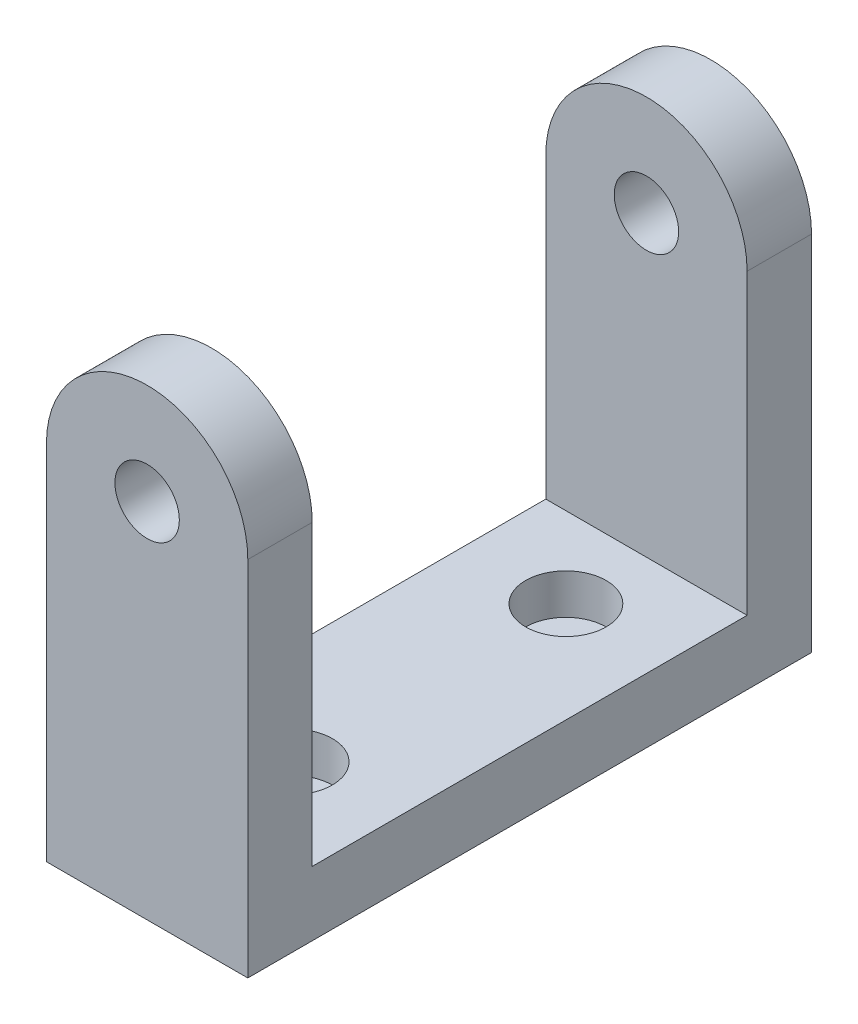
ISO-10303-21;
HEADER;
FILE_DESCRIPTION(('STEP AP214'),'2;1');
FILE_NAME('part.step','',(''),(''),'','','');
FILE_SCHEMA(('AUTOMOTIVE_DESIGN { 1 0 10303 214 1 1 1 1 }'));
ENDSEC;
DATA;
#1=APPLICATION_CONTEXT('core data for automotive mechanical design processes');
#2=APPLICATION_PROTOCOL_DEFINITION('international standard','automotive_design',2000,#1);
#3=PRODUCT_CONTEXT('',#1,'mechanical');
#4=PRODUCT('Part','Part','',(#3));
#5=PRODUCT_RELATED_PRODUCT_CATEGORY('part','',(#4));
#6=PRODUCT_DEFINITION_FORMATION('','',#4);
#7=PRODUCT_DEFINITION_CONTEXT('part definition',#1,'design');
#8=PRODUCT_DEFINITION('design','',#6,#7);
#9=PRODUCT_DEFINITION_SHAPE('','',#8);
#10=(LENGTH_UNIT() NAMED_UNIT(*) SI_UNIT(.MILLI.,.METRE.));
#11=(NAMED_UNIT(*) PLANE_ANGLE_UNIT() SI_UNIT($,.RADIAN.));
#12=(NAMED_UNIT(*) SI_UNIT($,.STERADIAN.) SOLID_ANGLE_UNIT());
#13=UNCERTAINTY_MEASURE_WITH_UNIT(LENGTH_MEASURE(1.E-05),#10,'distance_accuracy_value','');
#14=(GEOMETRIC_REPRESENTATION_CONTEXT(3) GLOBAL_UNCERTAINTY_ASSIGNED_CONTEXT((#13)) GLOBAL_UNIT_ASSIGNED_CONTEXT((#10,
#11,#12)) REPRESENTATION_CONTEXT('',''));
#15=CARTESIAN_POINT('',(0.,0.,0.));
#16=DIRECTION('',(0.,0.,1.));
#17=DIRECTION('',(1.,0.,0.));
#18=AXIS2_PLACEMENT_3D('',#15,#16,#17);
#19=CARTESIAN_POINT('',(-16.1932057392095,27.8256302521008,0.));
#20=DIRECTION('',(0.,0.,-1.));
#21=DIRECTION('',(-1.,0.,0.));
#22=AXIS2_PLACEMENT_3D('',#19,#20,#21);
#23=CYLINDRICAL_SURFACE('',#22,12.5);
#24=CARTESIAN_POINT('',(-16.1932057392095,27.8256302521008,62.));
#25=DIRECTION('',(0.,0.,1.));
#26=DIRECTION('',(0.,-1.,0.));
#27=AXIS2_PLACEMENT_3D('',#24,#25,#26);
#28=CIRCLE('',#27,12.5);
#29=CARTESIAN_POINT('',(-28.6932057392095,27.8256302521008,62.));
#30=VERTEX_POINT('',#29);
#31=CARTESIAN_POINT('',(-3.69320573920951,27.8256302521009,62.));
#32=VERTEX_POINT('',#31);
#33=EDGE_CURVE('E156',#30,#32,#28,.F.);
#34=ORIENTED_EDGE('',*,*,#33,.F.);
#35=DIRECTION('',(0.,0.,-1.));
#36=VECTOR('',#35,1.);
#37=CARTESIAN_POINT('',(-28.6932057392095,27.8256302521008,70.));
#38=LINE('',#37,#36);
#39=CARTESIAN_POINT('',(-28.6932057392095,27.8256302521008,70.));
#40=VERTEX_POINT('',#39);
#41=EDGE_CURVE('E134',#40,#30,#38,.T.);
#42=ORIENTED_EDGE('',*,*,#41,.F.);
#43=CARTESIAN_POINT('',(-16.1932057392095,27.8256302521008,70.));
#44=DIRECTION('',(0.,0.,1.));
#45=DIRECTION('',(1.,0.,0.));
#46=AXIS2_PLACEMENT_3D('',#43,#44,#45);
#47=CIRCLE('',#46,12.5);
#48=CARTESIAN_POINT('',(-3.69320573920951,27.8256302521009,70.));
#49=VERTEX_POINT('',#48);
#50=EDGE_CURVE('E58',#49,#40,#47,.T.);
#51=ORIENTED_EDGE('',*,*,#50,.F.);
#52=DIRECTION('',(0.,0.,-1.));
#53=VECTOR('',#52,1.);
#54=CARTESIAN_POINT('',(-3.69320573920951,27.8256302521009,70.));
#55=LINE('',#54,#53);
#56=EDGE_CURVE('E186',#32,#49,#55,.F.);
#57=ORIENTED_EDGE('',*,*,#56,.F.);
#58=EDGE_LOOP('',(#34,#42,#51,#57));
#59=FACE_BOUND('',#58,.T.);
#60=ADVANCED_FACE('F47',(#59),#23,.T.);
#61=CARTESIAN_POINT('',(-16.1932057392095,27.8256302521008,8.));
#62=DIRECTION('',(0.,0.,-1.));
#63=DIRECTION('',(0.,1.,0.));
#64=AXIS2_PLACEMENT_3D('',#61,#62,#63);
#65=CIRCLE('',#64,12.5);
#66=CARTESIAN_POINT('',(-3.69320573920951,27.8256302521009,8.));
#67=VERTEX_POINT('',#66);
#68=CARTESIAN_POINT('',(-28.6932057392095,27.8256302521008,8.));
#69=VERTEX_POINT('',#68);
#70=EDGE_CURVE('E152',#67,#69,#65,.F.);
#71=ORIENTED_EDGE('',*,*,#70,.F.);
#72=CARTESIAN_POINT('',(-3.69320573920951,27.8256302521009,0.));
#73=VERTEX_POINT('',#72);
#74=EDGE_CURVE('E187',#73,#67,#55,.F.);
#75=ORIENTED_EDGE('',*,*,#74,.F.);
#76=CARTESIAN_POINT('',(-16.1932057392095,27.8256302521008,0.));
#77=DIRECTION('',(0.,0.,1.));
#78=DIRECTION('',(1.,0.,0.));
#79=AXIS2_PLACEMENT_3D('',#76,#77,#78);
#80=CIRCLE('',#79,12.5);
#81=CARTESIAN_POINT('',(-28.6932057392095,27.8256302521008,0.));
#82=VERTEX_POINT('',#81);
#83=EDGE_CURVE('E194',#82,#73,#80,.F.);
#84=ORIENTED_EDGE('',*,*,#83,.F.);
#85=EDGE_CURVE('E191',#69,#82,#38,.T.);
#86=ORIENTED_EDGE('',*,*,#85,.F.);
#87=EDGE_LOOP('',(#71,#75,#84,#86));
#88=FACE_BOUND('',#87,.T.);
#89=ADVANCED_FACE('F50',(#88),#23,.T.);
#90=CARTESIAN_POINT('',(-28.6932057392095,40.3256302521008,70.));
#91=DIRECTION('',(1.,0.,0.));
#92=DIRECTION('',(0.,1.,0.));
#93=AXIS2_PLACEMENT_3D('',#90,#91,#92);
#94=PLANE('',#93);
#95=ORIENTED_EDGE('',*,*,#41,.T.);
#96=DIRECTION('',(0.,-1.,0.));
#97=VECTOR('',#96,1.);
#98=CARTESIAN_POINT('',(-28.6932057392095,40.3256302521008,62.));
#99=LINE('',#98,#97);
#100=CARTESIAN_POINT('',(-28.6932057392095,-9.17436974789917,62.));
#101=VERTEX_POINT('',#100);
#102=EDGE_CURVE('E116',#30,#101,#99,.T.);
#103=ORIENTED_EDGE('',*,*,#102,.T.);
#104=DIRECTION('',(0.,0.,-1.));
#105=VECTOR('',#104,1.);
#106=CARTESIAN_POINT('',(-28.6932057392095,-9.17436974789917,62.));
#107=LINE('',#106,#105);
#108=CARTESIAN_POINT('',(-28.6932057392095,-9.17436974789917,7.99999999999999));
#109=VERTEX_POINT('',#108);
#110=EDGE_CURVE('E124',#101,#109,#107,.T.);
#111=ORIENTED_EDGE('',*,*,#110,.T.);
#112=DIRECTION('',(0.,1.,0.));
#113=VECTOR('',#112,1.);
#114=CARTESIAN_POINT('',(-28.6932057392095,40.3256302521008,8.));
#115=LINE('',#114,#113);
#116=EDGE_CURVE('E121',#109,#69,#115,.T.);
#117=ORIENTED_EDGE('',*,*,#116,.T.);
#118=ORIENTED_EDGE('',*,*,#85,.T.);
#119=DIRECTION('',(0.,-1.,0.));
#120=VECTOR('',#119,1.);
#121=CARTESIAN_POINT('',(-28.6932057392095,40.3256302521008,0.));
#122=LINE('',#121,#120);
#123=CARTESIAN_POINT('',(-28.6932057392095,-17.1743697478992,0.));
#124=VERTEX_POINT('',#123);
#125=EDGE_CURVE('E159',#82,#124,#122,.T.);
#126=ORIENTED_EDGE('',*,*,#125,.T.);
#127=DIRECTION('',(0.,0.,-1.));
#128=VECTOR('',#127,1.);
#129=CARTESIAN_POINT('',(-28.6932057392095,-17.1743697478992,70.));
#130=LINE('',#129,#128);
#131=CARTESIAN_POINT('',(-28.6932057392095,-17.1743697478992,70.));
#132=VERTEX_POINT('',#131);
#133=EDGE_CURVE('E182',#132,#124,#130,.T.);
#134=ORIENTED_EDGE('',*,*,#133,.F.);
#135=DIRECTION('',(0.,-1.,0.));
#136=VECTOR('',#135,1.);
#137=CARTESIAN_POINT('',(-28.6932057392095,40.3256302521008,70.));
#138=LINE('',#137,#136);
#139=EDGE_CURVE('E160',#40,#132,#138,.T.);
#140=ORIENTED_EDGE('',*,*,#139,.F.);
#141=EDGE_LOOP('',(#95,#103,#111,#117,#118,#126,#134,#140));
#142=FACE_BOUND('',#141,.T.);
#143=ADVANCED_FACE('F132',(#142),#94,.F.);
#144=CARTESIAN_POINT('',(-28.6932057392095,-17.1743697478992,70.));
#145=DIRECTION('',(0.,1.,0.));
#146=DIRECTION('',(0.,0.,1.));
#147=AXIS2_PLACEMENT_3D('',#144,#145,#146);
#148=PLANE('',#147);
#149=DIRECTION('',(1.,0.,0.));
#150=VECTOR('',#149,1.);
#151=CARTESIAN_POINT('',(-28.6932057392095,-17.1743697478992,0.));
#152=LINE('',#151,#150);
#153=CARTESIAN_POINT('',(-3.69320573920951,-17.1743697478992,0.));
#154=VERTEX_POINT('',#153);
#155=EDGE_CURVE('E173',#124,#154,#152,.T.);
#156=ORIENTED_EDGE('',*,*,#155,.T.);
#157=DIRECTION('',(0.,0.,-1.));
#158=VECTOR('',#157,1.);
#159=CARTESIAN_POINT('',(-3.69320573920951,-17.1743697478992,70.));
#160=LINE('',#159,#158);
#161=CARTESIAN_POINT('',(-3.69320573920951,-17.1743697478992,70.));
#162=VERTEX_POINT('',#161);
#163=EDGE_CURVE('E170',#162,#154,#160,.T.);
#164=ORIENTED_EDGE('',*,*,#163,.F.);
#165=DIRECTION('',(1.,0.,0.));
#166=VECTOR('',#165,1.);
#167=CARTESIAN_POINT('',(-28.6932057392095,-17.1743697478992,70.));
#168=LINE('',#167,#166);
#169=EDGE_CURVE('E163',#132,#162,#168,.T.);
#170=ORIENTED_EDGE('',*,*,#169,.F.);
#171=ORIENTED_EDGE('',*,*,#133,.T.);
#172=EDGE_LOOP('',(#156,#164,#170,#171));
#173=FACE_BOUND('',#172,.T.);
#174=ADVANCED_FACE('F210',(#173),#148,.F.);
#175=CARTESIAN_POINT('',(-3.69320573920951,40.3256302521008,70.));
#176=DIRECTION('',(-1.,0.,0.));
#177=DIRECTION('',(0.,-1.,0.));
#178=AXIS2_PLACEMENT_3D('',#175,#176,#177);
#179=PLANE('',#178);
#180=DIRECTION('',(0.,0.,-1.));
#181=VECTOR('',#180,1.);
#182=CARTESIAN_POINT('',(-3.69320573920951,-9.17436974789916,62.));
#183=LINE('',#182,#181);
#184=CARTESIAN_POINT('',(-3.69320573920951,-9.17436974789915,62.));
#185=VERTEX_POINT('',#184);
#186=CARTESIAN_POINT('',(-3.69320573920951,-9.17436974789916,7.99999999999999));
#187=VERTEX_POINT('',#186);
#188=EDGE_CURVE('E140',#185,#187,#183,.T.);
#189=ORIENTED_EDGE('',*,*,#188,.F.);
#190=DIRECTION('',(0.,1.,0.));
#191=VECTOR('',#190,1.);
#192=CARTESIAN_POINT('',(-3.69320573920951,40.3256302521008,62.));
#193=LINE('',#192,#191);
#194=EDGE_CURVE('E11',#185,#32,#193,.T.);
#195=ORIENTED_EDGE('',*,*,#194,.T.);
#196=ORIENTED_EDGE('',*,*,#56,.T.);
#197=DIRECTION('',(0.,1.,0.));
#198=VECTOR('',#197,1.);
#199=CARTESIAN_POINT('',(-3.69320573920951,40.3256302521008,70.));
#200=LINE('',#199,#198);
#201=EDGE_CURVE('E167',#162,#49,#200,.T.);
#202=ORIENTED_EDGE('',*,*,#201,.F.);
#203=ORIENTED_EDGE('',*,*,#163,.T.);
#204=DIRECTION('',(0.,1.,0.));
#205=VECTOR('',#204,1.);
#206=CARTESIAN_POINT('',(-3.69320573920951,40.3256302521008,0.));
#207=LINE('',#206,#205);
#208=EDGE_CURVE('E164',#154,#73,#207,.T.);
#209=ORIENTED_EDGE('',*,*,#208,.T.);
#210=ORIENTED_EDGE('',*,*,#74,.T.);
#211=DIRECTION('',(0.,1.,0.));
#212=VECTOR('',#211,1.);
#213=CARTESIAN_POINT('',(-3.69320573920951,40.3256302521008,8.));
#214=LINE('',#213,#212);
#215=EDGE_CURVE('E136',#187,#67,#214,.T.);
#216=ORIENTED_EDGE('',*,*,#215,.F.);
#217=EDGE_LOOP('',(#189,#195,#196,#202,#203,#209,#210,#216));
#218=FACE_BOUND('',#217,.T.);
#219=ADVANCED_FACE('F203',(#218),#179,.F.);
#220=CARTESIAN_POINT('',(0.,0.,70.));
#221=DIRECTION('',(0.,0.,1.));
#222=DIRECTION('',(1.,0.,0.));
#223=AXIS2_PLACEMENT_3D('',#220,#221,#222);
#224=PLANE('',#223);
#225=CARTESIAN_POINT('',(-16.1932057392095,27.8256302521008,70.));
#226=DIRECTION('',(0.,0.,1.));
#227=DIRECTION('',(1.,0.,0.));
#228=AXIS2_PLACEMENT_3D('',#225,#226,#227);
#229=CIRCLE('',#228,4.);
#230=CARTESIAN_POINT('',(-12.1932057392095,27.8256302521008,70.));
#231=VERTEX_POINT('',#230);
#232=EDGE_CURVE('E262',#231,#231,#229,.T.);
#233=ORIENTED_EDGE('',*,*,#232,.F.);
#234=EDGE_LOOP('',(#233));
#235=FACE_BOUND('',#234,.T.);
#236=ORIENTED_EDGE('',*,*,#201,.T.);
#237=ORIENTED_EDGE('',*,*,#50,.T.);
#238=ORIENTED_EDGE('',*,*,#139,.T.);
#239=ORIENTED_EDGE('',*,*,#169,.T.);
#240=EDGE_LOOP('',(#236,#237,#238,#239));
#241=FACE_BOUND('',#240,.T.);
#242=ADVANCED_FACE('F205',(#235,#241),#224,.T.);
#243=CARTESIAN_POINT('',(0.,0.,0.));
#244=DIRECTION('',(0.,0.,1.));
#245=DIRECTION('',(1.,0.,0.));
#246=AXIS2_PLACEMENT_3D('',#243,#244,#245);
#247=PLANE('',#246);
#248=CARTESIAN_POINT('',(-16.1932057392095,27.8256302521008,0.));
#249=DIRECTION('',(0.,0.,1.));
#250=DIRECTION('',(1.,0.,0.));
#251=AXIS2_PLACEMENT_3D('',#248,#249,#250);
#252=CIRCLE('',#251,4.);
#253=CARTESIAN_POINT('',(-12.1932057392095,27.8256302521008,0.));
#254=VERTEX_POINT('',#253);
#255=EDGE_CURVE('E265',#254,#254,#252,.T.);
#256=ORIENTED_EDGE('',*,*,#255,.T.);
#257=EDGE_LOOP('',(#256));
#258=FACE_BOUND('',#257,.T.);
#259=ORIENTED_EDGE('',*,*,#125,.F.);
#260=ORIENTED_EDGE('',*,*,#83,.T.);
#261=ORIENTED_EDGE('',*,*,#208,.F.);
#262=ORIENTED_EDGE('',*,*,#155,.F.);
#263=EDGE_LOOP('',(#259,#260,#261,#262));
#264=FACE_BOUND('',#263,.T.);
#265=ADVANCED_FACE('F215',(#258,#264),#247,.F.);
#266=CARTESIAN_POINT('',(-28.6932057392095,40.3256302521008,62.));
#267=DIRECTION('',(0.,0.,1.));
#268=DIRECTION('',(0.,-1.,0.));
#269=AXIS2_PLACEMENT_3D('',#266,#267,#268);
#270=PLANE('',#269);
#271=CARTESIAN_POINT('',(-16.1932057392095,27.8256302521008,62.));
#272=DIRECTION('',(0.,0.,1.));
#273=DIRECTION('',(0.,-1.,0.));
#274=AXIS2_PLACEMENT_3D('',#271,#272,#273);
#275=CIRCLE('',#274,4.);
#276=CARTESIAN_POINT('',(-16.1932057392095,23.8256302521008,62.));
#277=VERTEX_POINT('',#276);
#278=EDGE_CURVE('E271',#277,#277,#275,.T.);
#279=ORIENTED_EDGE('',*,*,#278,.T.);
#280=EDGE_LOOP('',(#279));
#281=FACE_BOUND('',#280,.T.);
#282=ORIENTED_EDGE('',*,*,#33,.T.);
#283=ORIENTED_EDGE('',*,*,#194,.F.);
#284=DIRECTION('',(1.,0.,0.));
#285=VECTOR('',#284,1.);
#286=CARTESIAN_POINT('',(-28.6932057392095,-9.17436974789917,62.));
#287=LINE('',#286,#285);
#288=EDGE_CURVE('E65',#101,#185,#287,.T.);
#289=ORIENTED_EDGE('',*,*,#288,.F.);
#290=ORIENTED_EDGE('',*,*,#102,.F.);
#291=EDGE_LOOP('',(#282,#283,#289,#290));
#292=FACE_BOUND('',#291,.T.);
#293=ADVANCED_FACE('F114',(#281,#292),#270,.F.);
#294=CARTESIAN_POINT('',(-28.6932057392095,40.3256302521008,8.));
#295=DIRECTION('',(0.,0.,-1.));
#296=DIRECTION('',(0.,1.,0.));
#297=AXIS2_PLACEMENT_3D('',#294,#295,#296);
#298=PLANE('',#297);
#299=CARTESIAN_POINT('',(-16.1932057392095,27.8256302521008,8.));
#300=DIRECTION('',(0.,0.,-1.));
#301=DIRECTION('',(0.,1.,0.));
#302=AXIS2_PLACEMENT_3D('',#299,#300,#301);
#303=CIRCLE('',#302,4.);
#304=CARTESIAN_POINT('',(-16.1932057392095,31.8256302521008,8.));
#305=VERTEX_POINT('',#304);
#306=EDGE_CURVE('E52',#305,#305,#303,.T.);
#307=ORIENTED_EDGE('',*,*,#306,.T.);
#308=EDGE_LOOP('',(#307));
#309=FACE_BOUND('',#308,.T.);
#310=ORIENTED_EDGE('',*,*,#70,.T.);
#311=ORIENTED_EDGE('',*,*,#116,.F.);
#312=DIRECTION('',(1.,0.,0.));
#313=VECTOR('',#312,1.);
#314=CARTESIAN_POINT('',(-28.6932057392095,-9.17436974789917,7.99999999999999));
#315=LINE('',#314,#313);
#316=EDGE_CURVE('E120',#109,#187,#315,.T.);
#317=ORIENTED_EDGE('',*,*,#316,.T.);
#318=ORIENTED_EDGE('',*,*,#215,.T.);
#319=EDGE_LOOP('',(#310,#311,#317,#318));
#320=FACE_BOUND('',#319,.T.);
#321=ADVANCED_FACE('F222',(#309,#320),#298,.F.);
#322=CARTESIAN_POINT('',(-28.6932057392095,-9.17436974789917,62.));
#323=DIRECTION('',(0.,-1.,0.));
#324=DIRECTION('',(1.,0.,0.));
#325=AXIS2_PLACEMENT_3D('',#322,#323,#324);
#326=PLANE('',#325);
#327=CARTESIAN_POINT('',(-16.1932057392095,-9.17436974789916,18.));
#328=DIRECTION('',(0.,1.,0.));
#329=DIRECTION('',(-1.,0.,0.));
#330=AXIS2_PLACEMENT_3D('',#327,#328,#329);
#331=CIRCLE('',#330,5.);
#332=CARTESIAN_POINT('',(-21.1932057392095,-9.17436974789916,18.));
#333=VERTEX_POINT('',#332);
#334=EDGE_CURVE('E278',#333,#333,#331,.T.);
#335=ORIENTED_EDGE('',*,*,#334,.F.);
#336=EDGE_LOOP('',(#335));
#337=FACE_BOUND('',#336,.T.);
#338=CARTESIAN_POINT('',(-16.1932057392095,-9.17436974789916,52.));
#339=DIRECTION('',(0.,1.,0.));
#340=DIRECTION('',(-1.,0.,0.));
#341=AXIS2_PLACEMENT_3D('',#338,#339,#340);
#342=CIRCLE('',#341,5.);
#343=CARTESIAN_POINT('',(-21.1932057392095,-9.17436974789916,52.));
#344=VERTEX_POINT('',#343);
#345=EDGE_CURVE('E281',#344,#344,#342,.T.);
#346=ORIENTED_EDGE('',*,*,#345,.F.);
#347=EDGE_LOOP('',(#346));
#348=FACE_BOUND('',#347,.T.);
#349=ORIENTED_EDGE('',*,*,#188,.T.);
#350=ORIENTED_EDGE('',*,*,#316,.F.);
#351=ORIENTED_EDGE('',*,*,#110,.F.);
#352=ORIENTED_EDGE('',*,*,#288,.T.);
#353=EDGE_LOOP('',(#349,#350,#351,#352));
#354=FACE_BOUND('',#353,.T.);
#355=ADVANCED_FACE('F125',(#337,#348,#354),#326,.F.);
#356=CARTESIAN_POINT('',(-16.1932057392095,-14.1743697478992,52.));
#357=DIRECTION('',(0.,1.,0.));
#358=DIRECTION('',(-1.,0.,0.));
#359=AXIS2_PLACEMENT_3D('',#356,#357,#358);
#360=CYLINDRICAL_SURFACE('',#359,5.);
#361=CARTESIAN_POINT('',(-16.1932057392095,-14.1743697478992,52.));
#362=DIRECTION('',(0.,1.,0.));
#363=DIRECTION('',(-1.,0.,0.));
#364=AXIS2_PLACEMENT_3D('',#361,#362,#363);
#365=CIRCLE('',#364,5.);
#366=CARTESIAN_POINT('',(-21.1932057392095,-14.1743697478992,52.));
#367=VERTEX_POINT('',#366);
#368=EDGE_CURVE('E143',#367,#367,#365,.T.);
#369=ORIENTED_EDGE('',*,*,#368,.F.);
#370=EDGE_LOOP('',(#369));
#371=FACE_BOUND('',#370,.T.);
#372=ORIENTED_EDGE('',*,*,#345,.T.);
#373=EDGE_LOOP('',(#372));
#374=FACE_BOUND('',#373,.T.);
#375=ADVANCED_FACE('F231',(#371,#374),#360,.F.);
#376=CARTESIAN_POINT('',(-16.1932057392095,-14.1743697478992,52.));
#377=DIRECTION('',(0.,1.,0.));
#378=DIRECTION('',(-1.,0.,0.));
#379=AXIS2_PLACEMENT_3D('',#376,#377,#378);
#380=PLANE('',#379);
#381=ORIENTED_EDGE('',*,*,#368,.T.);
#382=EDGE_LOOP('',(#381));
#383=FACE_BOUND('',#382,.T.);
#384=ADVANCED_FACE('F290',(#383),#380,.T.);
#385=CARTESIAN_POINT('',(-16.1932057392095,-14.1743697478992,18.));
#386=DIRECTION('',(0.,1.,0.));
#387=DIRECTION('',(-1.,0.,0.));
#388=AXIS2_PLACEMENT_3D('',#385,#386,#387);
#389=CYLINDRICAL_SURFACE('',#388,5.);
#390=CARTESIAN_POINT('',(-16.1932057392095,-14.1743697478992,18.));
#391=DIRECTION('',(0.,1.,0.));
#392=DIRECTION('',(-1.,0.,0.));
#393=AXIS2_PLACEMENT_3D('',#390,#391,#392);
#394=CIRCLE('',#393,5.);
#395=CARTESIAN_POINT('',(-21.1932057392095,-14.1743697478992,18.));
#396=VERTEX_POINT('',#395);
#397=EDGE_CURVE('E149',#396,#396,#394,.T.);
#398=ORIENTED_EDGE('',*,*,#397,.F.);
#399=EDGE_LOOP('',(#398));
#400=FACE_BOUND('',#399,.T.);
#401=ORIENTED_EDGE('',*,*,#334,.T.);
#402=EDGE_LOOP('',(#401));
#403=FACE_BOUND('',#402,.T.);
#404=ADVANCED_FACE('F297',(#400,#403),#389,.F.);
#405=CARTESIAN_POINT('',(-16.1932057392095,-14.1743697478992,18.));
#406=DIRECTION('',(0.,1.,0.));
#407=DIRECTION('',(-1.,0.,0.));
#408=AXIS2_PLACEMENT_3D('',#405,#406,#407);
#409=PLANE('',#408);
#410=ORIENTED_EDGE('',*,*,#397,.T.);
#411=EDGE_LOOP('',(#410));
#412=FACE_BOUND('',#411,.T.);
#413=ADVANCED_FACE('F301',(#412),#409,.T.);
#414=CARTESIAN_POINT('',(-16.1932057392095,27.8256302521008,0.));
#415=DIRECTION('',(0.,0.,1.));
#416=DIRECTION('',(1.,0.,0.));
#417=AXIS2_PLACEMENT_3D('',#414,#415,#416);
#418=CYLINDRICAL_SURFACE('',#417,4.);
#419=ORIENTED_EDGE('',*,*,#255,.F.);
#420=EDGE_LOOP('',(#419));
#421=FACE_BOUND('',#420,.T.);
#422=ORIENTED_EDGE('',*,*,#306,.F.);
#423=EDGE_LOOP('',(#422));
#424=FACE_BOUND('',#423,.T.);
#425=ADVANCED_FACE('F304',(#421,#424),#418,.F.);
#426=ORIENTED_EDGE('',*,*,#232,.T.);
#427=EDGE_LOOP('',(#426));
#428=FACE_BOUND('',#427,.T.);
#429=ORIENTED_EDGE('',*,*,#278,.F.);
#430=EDGE_LOOP('',(#429));
#431=FACE_BOUND('',#430,.T.);
#432=ADVANCED_FACE('F306',(#428,#431),#418,.F.);
#433=CLOSED_SHELL('',(#60,#89,#143,#174,#219,#242,#265,#293,#321,#355,#375,#384,#404,#413,#425,#432));
#434=MANIFOLD_SOLID_BREP('B2',#433);
#435=ADVANCED_BREP_SHAPE_REPRESENTATION('',(#18,#434),#14);
#436=SHAPE_DEFINITION_REPRESENTATION(#9,#435);
ENDSEC;
END-ISO-10303-21;
